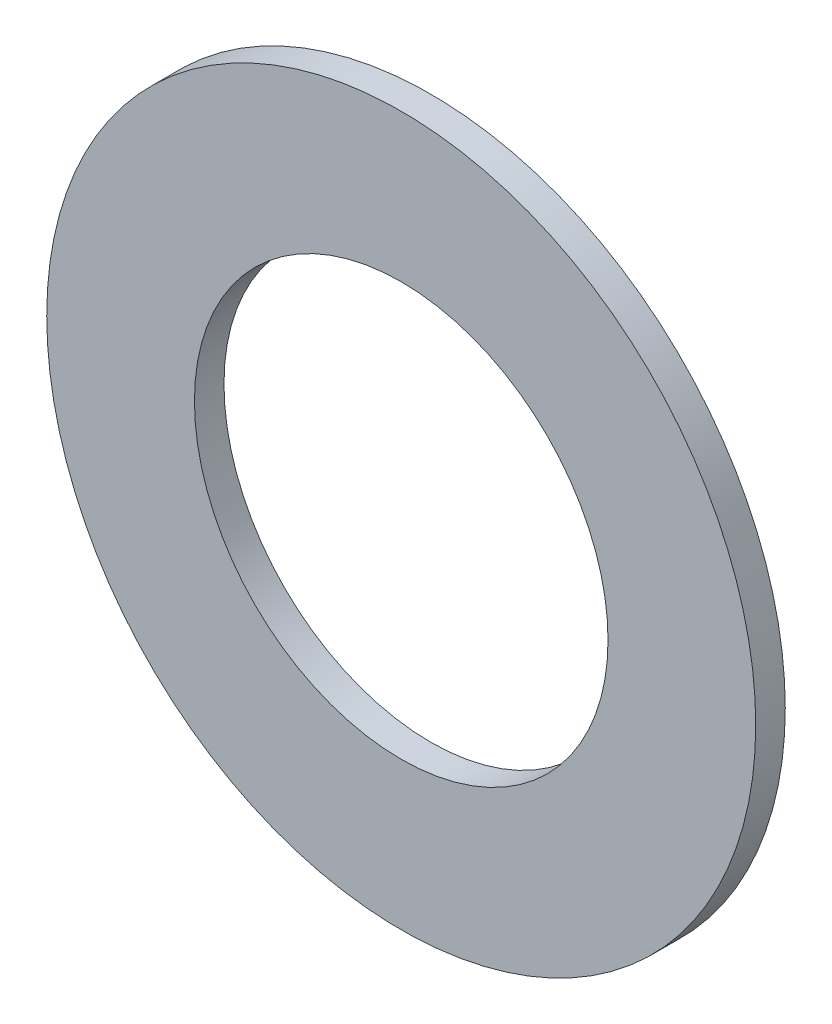
ISO-10303-21;
HEADER;
FILE_DESCRIPTION(('STEP AP214'),'2;1');
FILE_NAME('part.step','',(''),(''),'','','');
FILE_SCHEMA(('AUTOMOTIVE_DESIGN { 1 0 10303 214 1 1 1 1 }'));
ENDSEC;
DATA;
#1=APPLICATION_CONTEXT('core data for automotive mechanical design processes');
#2=APPLICATION_PROTOCOL_DEFINITION('international standard','automotive_design',2000,#1);
#3=PRODUCT_CONTEXT('',#1,'mechanical');
#4=PRODUCT('Part','Part','',(#3));
#5=PRODUCT_RELATED_PRODUCT_CATEGORY('part','',(#4));
#6=PRODUCT_DEFINITION_FORMATION('','',#4);
#7=PRODUCT_DEFINITION_CONTEXT('part definition',#1,'design');
#8=PRODUCT_DEFINITION('design','',#6,#7);
#9=PRODUCT_DEFINITION_SHAPE('','',#8);
#10=(LENGTH_UNIT() NAMED_UNIT(*) SI_UNIT(.MILLI.,.METRE.));
#11=(NAMED_UNIT(*) PLANE_ANGLE_UNIT() SI_UNIT($,.RADIAN.));
#12=(NAMED_UNIT(*) SI_UNIT($,.STERADIAN.) SOLID_ANGLE_UNIT());
#13=UNCERTAINTY_MEASURE_WITH_UNIT(LENGTH_MEASURE(1.E-05),#10,'distance_accuracy_value','');
#14=(GEOMETRIC_REPRESENTATION_CONTEXT(3) GLOBAL_UNCERTAINTY_ASSIGNED_CONTEXT((#13)) GLOBAL_UNIT_ASSIGNED_CONTEXT((#10,
#11,#12)) REPRESENTATION_CONTEXT('',''));
#15=CARTESIAN_POINT('',(0.,0.,0.));
#16=DIRECTION('',(0.,0.,1.));
#17=DIRECTION('',(1.,0.,0.));
#18=AXIS2_PLACEMENT_3D('',#15,#16,#17);
#19=CARTESIAN_POINT('',(0.,0.,6.35));
#20=DIRECTION('',(0.,0.,1.));
#21=DIRECTION('',(1.,0.,0.));
#22=AXIS2_PLACEMENT_3D('',#19,#20,#21);
#23=PLANE('',#22);
#24=CARTESIAN_POINT('',(0.,0.,6.35));
#25=DIRECTION('',(0.,0.,1.));
#26=DIRECTION('',(1.,0.,0.));
#27=AXIS2_PLACEMENT_3D('',#24,#25,#26);
#28=CIRCLE('',#27,76.2);
#29=CARTESIAN_POINT('',(76.2,0.,6.35));
#30=VERTEX_POINT('',#29);
#31=EDGE_CURVE('E10',#30,#30,#28,.T.);
#32=ORIENTED_EDGE('',*,*,#31,.T.);
#33=EDGE_LOOP('',(#32));
#34=FACE_BOUND('',#33,.T.);
#35=CARTESIAN_POINT('',(0.,0.,6.35));
#36=DIRECTION('',(0.,0.,1.));
#37=DIRECTION('',(1.,0.,0.));
#38=AXIS2_PLACEMENT_3D('',#35,#36,#37);
#39=CIRCLE('',#38,44.45);
#40=CARTESIAN_POINT('',(44.45,0.,6.35));
#41=VERTEX_POINT('',#40);
#42=EDGE_CURVE('E46',#41,#41,#39,.T.);
#43=ORIENTED_EDGE('',*,*,#42,.F.);
#44=EDGE_LOOP('',(#43));
#45=FACE_BOUND('',#44,.T.);
#46=ADVANCED_FACE('F35',(#34,#45),#23,.T.);
#47=CARTESIAN_POINT('',(0.,0.,0.));
#48=DIRECTION('',(0.,0.,1.));
#49=DIRECTION('',(1.,0.,0.));
#50=AXIS2_PLACEMENT_3D('',#47,#48,#49);
#51=PLANE('',#50);
#52=CARTESIAN_POINT('',(0.,0.,0.));
#53=DIRECTION('',(0.,0.,1.));
#54=DIRECTION('',(1.,0.,0.));
#55=AXIS2_PLACEMENT_3D('',#52,#53,#54);
#56=CIRCLE('',#55,76.2);
#57=CARTESIAN_POINT('',(76.2,0.,0.));
#58=VERTEX_POINT('',#57);
#59=EDGE_CURVE('E39',#58,#58,#56,.T.);
#60=ORIENTED_EDGE('',*,*,#59,.F.);
#61=EDGE_LOOP('',(#60));
#62=FACE_BOUND('',#61,.T.);
#63=CARTESIAN_POINT('',(0.,0.,0.));
#64=DIRECTION('',(0.,0.,1.));
#65=DIRECTION('',(1.,0.,0.));
#66=AXIS2_PLACEMENT_3D('',#63,#64,#65);
#67=CIRCLE('',#66,44.45);
#68=CARTESIAN_POINT('',(44.45,0.,0.));
#69=VERTEX_POINT('',#68);
#70=EDGE_CURVE('E48',#69,#69,#67,.T.);
#71=ORIENTED_EDGE('',*,*,#70,.T.);
#72=EDGE_LOOP('',(#71));
#73=FACE_BOUND('',#72,.T.);
#74=ADVANCED_FACE('F58',(#62,#73),#51,.F.);
#75=CARTESIAN_POINT('',(0.,0.,6.35));
#76=DIRECTION('',(0.,0.,-1.));
#77=DIRECTION('',(-1.,0.,0.));
#78=AXIS2_PLACEMENT_3D('',#75,#76,#77);
#79=CYLINDRICAL_SURFACE('',#78,76.2);
#80=ORIENTED_EDGE('',*,*,#31,.F.);
#81=EDGE_LOOP('',(#80));
#82=FACE_BOUND('',#81,.T.);
#83=ORIENTED_EDGE('',*,*,#59,.T.);
#84=EDGE_LOOP('',(#83));
#85=FACE_BOUND('',#84,.T.);
#86=ADVANCED_FACE('F37',(#82,#85),#79,.T.);
#87=CARTESIAN_POINT('',(0.,0.,6.35));
#88=DIRECTION('',(0.,0.,-1.));
#89=DIRECTION('',(-1.,0.,0.));
#90=AXIS2_PLACEMENT_3D('',#87,#88,#89);
#91=CYLINDRICAL_SURFACE('',#90,44.45);
#92=ORIENTED_EDGE('',*,*,#42,.T.);
#93=EDGE_LOOP('',(#92));
#94=FACE_BOUND('',#93,.T.);
#95=ORIENTED_EDGE('',*,*,#70,.F.);
#96=EDGE_LOOP('',(#95));
#97=FACE_BOUND('',#96,.T.);
#98=ADVANCED_FACE('F54',(#94,#97),#91,.F.);
#99=CLOSED_SHELL('',(#46,#74,#86,#98));
#100=MANIFOLD_SOLID_BREP('B2',#99);
#101=ADVANCED_BREP_SHAPE_REPRESENTATION('',(#18,#100),#14);
#102=SHAPE_DEFINITION_REPRESENTATION(#9,#101);
ENDSEC;
END-ISO-10303-21;
